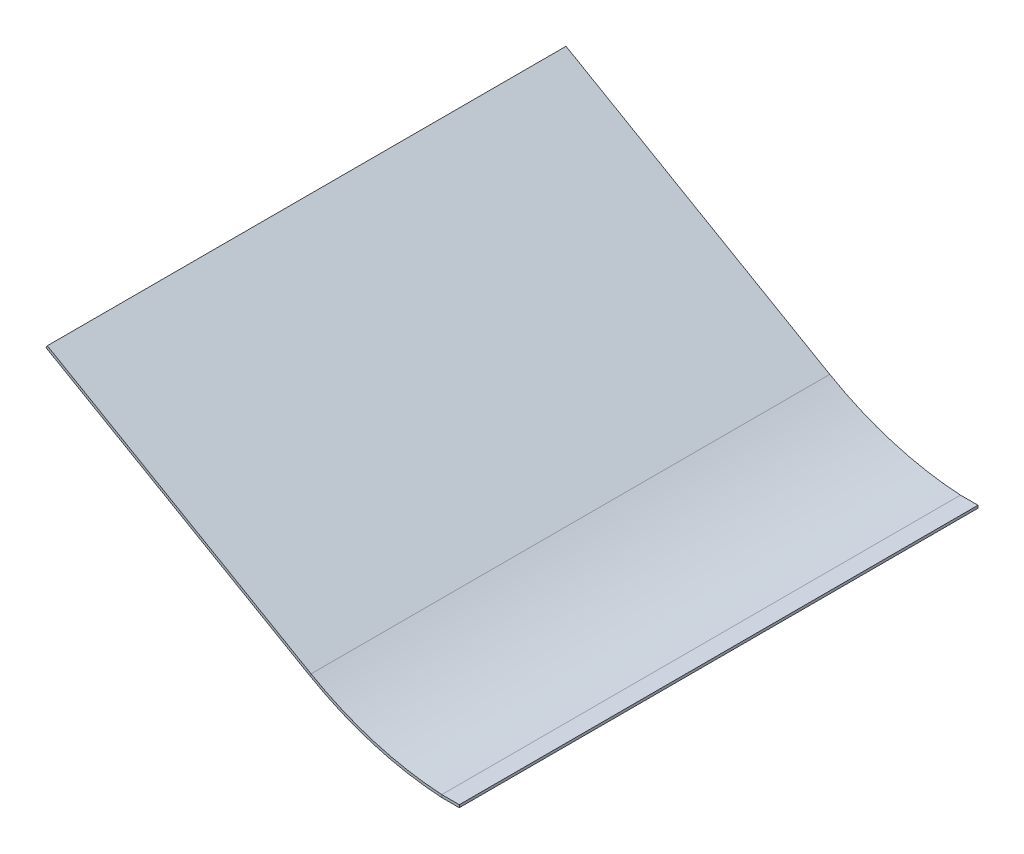
ISO-10303-21;
HEADER;
FILE_DESCRIPTION(('STEP AP214'),'2;1');
FILE_NAME('part.step','',(''),(''),'','','');
FILE_SCHEMA(('AUTOMOTIVE_DESIGN { 1 0 10303 214 1 1 1 1 }'));
ENDSEC;
DATA;
#1=APPLICATION_CONTEXT('core data for automotive mechanical design processes');
#2=APPLICATION_PROTOCOL_DEFINITION('international standard','automotive_design',2000,#1);
#3=PRODUCT_CONTEXT('',#1,'mechanical');
#4=PRODUCT('Part','Part','',(#3));
#5=PRODUCT_RELATED_PRODUCT_CATEGORY('part','',(#4));
#6=PRODUCT_DEFINITION_FORMATION('','',#4);
#7=PRODUCT_DEFINITION_CONTEXT('part definition',#1,'design');
#8=PRODUCT_DEFINITION('design','',#6,#7);
#9=PRODUCT_DEFINITION_SHAPE('','',#8);
#10=(LENGTH_UNIT() NAMED_UNIT(*) SI_UNIT(.MILLI.,.METRE.));
#11=(NAMED_UNIT(*) PLANE_ANGLE_UNIT() SI_UNIT($,.RADIAN.));
#12=(NAMED_UNIT(*) SI_UNIT($,.STERADIAN.) SOLID_ANGLE_UNIT());
#13=UNCERTAINTY_MEASURE_WITH_UNIT(LENGTH_MEASURE(1.E-05),#10,'distance_accuracy_value','');
#14=(GEOMETRIC_REPRESENTATION_CONTEXT(3) GLOBAL_UNCERTAINTY_ASSIGNED_CONTEXT((#13)) GLOBAL_UNIT_ASSIGNED_CONTEXT((#10,
#11,#12)) REPRESENTATION_CONTEXT('',''));
#15=CARTESIAN_POINT('',(0.,0.,0.));
#16=DIRECTION('',(0.,0.,1.));
#17=DIRECTION('',(1.,0.,0.));
#18=AXIS2_PLACEMENT_3D('',#15,#16,#17);
#19=CARTESIAN_POINT('',(-119.69287484573,2.39148694798163,0.));
#20=DIRECTION('',(0.,0.,-1.));
#21=DIRECTION('',(-0.866025403784437,0.500000000000003,0.));
#22=AXIS2_PLACEMENT_3D('',#19,#20,#21);
#23=PLANE('',#22);
#24=DIRECTION('',(0.500000000000003,0.866025403784437,0.));
#25=VECTOR('',#24,1.);
#26=CARTESIAN_POINT('',(-269.692874845731,88.9940273264263,0.));
#27=LINE('',#26,#25);
#28=CARTESIAN_POINT('',(-269.692874845731,88.9940273264263,0.));
#29=VERTEX_POINT('',#28);
#30=CARTESIAN_POINT('',(-268.942874845731,90.293065432103,0.));
#31=VERTEX_POINT('',#30);
#32=EDGE_CURVE('E11',#29,#31,#27,.T.);
#33=ORIENTED_EDGE('',*,*,#32,.F.);
#34=DIRECTION('',(-0.866025403784437,0.500000000000003,0.));
#35=VECTOR('',#34,1.);
#36=CARTESIAN_POINT('',(-119.69287484573,2.39148694798163,0.));
#37=LINE('',#36,#35);
#38=CARTESIAN_POINT('',(-119.69287484573,2.39148694798166,0.));
#39=VERTEX_POINT('',#38);
#40=EDGE_CURVE('E201',#39,#29,#37,.T.);
#41=ORIENTED_EDGE('',*,*,#40,.F.);
#42=DIRECTION('',(0.499999999999995,0.866025403784441,0.));
#43=VECTOR('',#42,1.);
#44=CARTESIAN_POINT('',(-119.69287484573,2.39148694798166,0.));
#45=LINE('',#44,#43);
#46=CARTESIAN_POINT('',(-118.94287484573,3.69052505365829,0.));
#47=VERTEX_POINT('',#46);
#48=EDGE_CURVE('E49',#39,#47,#45,.T.);
#49=ORIENTED_EDGE('',*,*,#48,.T.);
#50=DIRECTION('',(-0.866025403784437,0.500000000000003,0.));
#51=VECTOR('',#50,1.);
#52=CARTESIAN_POINT('',(-118.94287484573,3.69052505365828,0.));
#53=LINE('',#52,#51);
#54=EDGE_CURVE('E156',#47,#31,#53,.T.);
#55=ORIENTED_EDGE('',*,*,#54,.T.);
#56=EDGE_LOOP('',(#33,#41,#49,#55));
#57=FACE_BOUND('',#56,.T.);
#58=ADVANCED_FACE('F39',(#57),#23,.F.);
#59=CARTESIAN_POINT('',(-34.6410161513776,149.705627484771,0.));
#60=DIRECTION('',(0.,0.,1.));
#61=DIRECTION('',(1.,0.,0.));
#62=AXIS2_PLACEMENT_3D('',#59,#60,#61);
#63=PLANE('',#62);
#64=ORIENTED_EDGE('',*,*,#48,.F.);
#65=CARTESIAN_POINT('',(-34.6410161513776,149.705627484771,0.));
#66=DIRECTION('',(0.,0.,-1.));
#67=DIRECTION('',(-0.0589332359340006,-0.998261926401256,0.));
#68=AXIS2_PLACEMENT_3D('',#65,#66,#67);
#69=CIRCLE('',#68,170.103717388707);
#70=CARTESIAN_POINT('',(-44.6657786614968,-20.1024371236945,0.));
#71=VERTEX_POINT('',#70);
#72=EDGE_CURVE('E193',#71,#39,#69,.T.);
#73=ORIENTED_EDGE('',*,*,#72,.F.);
#74=DIRECTION('',(0.0439617176310073,0.999033216356159,0.));
#75=VECTOR('',#74,1.);
#76=CARTESIAN_POINT('',(-44.6657786614968,-20.1024371236945,0.));
#77=LINE('',#76,#75);
#78=CARTESIAN_POINT('',(-44.5998286082665,-18.6037173887073,0.));
#79=VERTEX_POINT('',#78);
#80=EDGE_CURVE('E219',#71,#79,#77,.T.);
#81=ORIENTED_EDGE('',*,*,#80,.T.);
#82=CARTESIAN_POINT('',(-34.6410161513776,149.705627484771,0.));
#83=DIRECTION('',(0.,0.,-1.));
#84=DIRECTION('',(-1.,0.,0.));
#85=AXIS2_PLACEMENT_3D('',#82,#83,#84);
#86=CIRCLE('',#85,168.603717388707);
#87=EDGE_CURVE('E162',#79,#47,#86,.T.);
#88=ORIENTED_EDGE('',*,*,#87,.T.);
#89=EDGE_LOOP('',(#64,#73,#81,#88));
#90=FACE_BOUND('',#89,.T.);
#91=ADVANCED_FACE('F227',(#90),#63,.T.);
#92=CARTESIAN_POINT('',(-44.6223684399079,-19.3671173887073,0.));
#93=DIRECTION('',(0.,0.,1.));
#94=DIRECTION('',(1.,0.,0.));
#95=AXIS2_PLACEMENT_3D('',#92,#93,#94);
#96=PLANE('',#95);
#97=ORIENTED_EDGE('',*,*,#80,.F.);
#98=CARTESIAN_POINT('',(-44.6223684399079,-19.3671173887073,0.));
#99=DIRECTION('',(0.,0.,-1.));
#100=DIRECTION('',(0.,-1.,0.));
#101=AXIS2_PLACEMENT_3D('',#98,#99,#100);
#102=CIRCLE('',#101,0.7366);
#103=CARTESIAN_POINT('',(-44.6223684399079,-20.1037173887073,0.));
#104=VERTEX_POINT('',#103);
#105=EDGE_CURVE('E187',#104,#71,#102,.T.);
#106=ORIENTED_EDGE('',*,*,#105,.F.);
#107=DIRECTION('',(0.0150248582367937,0.999887120446585,0.));
#108=VECTOR('',#107,1.);
#109=CARTESIAN_POINT('',(-44.6223684399079,-20.1037173887073,0.));
#110=LINE('',#109,#108);
#111=EDGE_CURVE('E216',#104,#79,#110,.T.);
#112=ORIENTED_EDGE('',*,*,#111,.T.);
#113=EDGE_LOOP('',(#97,#106,#112));
#114=FACE_BOUND('',#113,.T.);
#115=ADVANCED_FACE('F231',(#114),#96,.T.);
#116=CARTESIAN_POINT('',(-34.6410161513776,-20.1037173887073,0.));
#117=DIRECTION('',(0.,0.,-1.));
#118=DIRECTION('',(-1.,0.,0.));
#119=AXIS2_PLACEMENT_3D('',#116,#117,#118);
#120=PLANE('',#119);
#121=ORIENTED_EDGE('',*,*,#111,.F.);
#122=DIRECTION('',(-1.,0.,0.));
#123=VECTOR('',#122,1.);
#124=CARTESIAN_POINT('',(-34.6410161513776,-20.1037173887073,0.));
#125=LINE('',#124,#123);
#126=CARTESIAN_POINT('',(-34.6410161513776,-20.1037173887073,0.));
#127=VERTEX_POINT('',#126);
#128=EDGE_CURVE('E183',#127,#104,#125,.T.);
#129=ORIENTED_EDGE('',*,*,#128,.F.);
#130=DIRECTION('',(0.,1.,0.));
#131=VECTOR('',#130,1.);
#132=CARTESIAN_POINT('',(-34.6410161513776,-20.1037173887073,0.));
#133=LINE('',#132,#131);
#134=CARTESIAN_POINT('',(-34.6410161513776,-18.6037173887073,0.));
#135=VERTEX_POINT('',#134);
#136=EDGE_CURVE('E101',#127,#135,#133,.T.);
#137=ORIENTED_EDGE('',*,*,#136,.T.);
#138=DIRECTION('',(1.,0.,0.));
#139=VECTOR('',#138,1.);
#140=CARTESIAN_POINT('',(-34.6410161513776,-18.6037173887073,0.));
#141=LINE('',#140,#139);
#142=EDGE_CURVE('E149',#135,#79,#141,.F.);
#143=ORIENTED_EDGE('',*,*,#142,.T.);
#144=EDGE_LOOP('',(#121,#129,#137,#143));
#145=FACE_BOUND('',#144,.T.);
#146=ADVANCED_FACE('F233',(#145),#120,.F.);
#147=CARTESIAN_POINT('',(-34.6410161513776,-20.1037173887073,0.));
#148=DIRECTION('',(1.,0.,0.));
#149=DIRECTION('',(0.,0.,-1.));
#150=AXIS2_PLACEMENT_3D('',#147,#148,#149);
#151=PLANE('',#150);
#152=ORIENTED_EDGE('',*,*,#136,.F.);
#153=DIRECTION('',(0.,0.,-1.));
#154=VECTOR('',#153,1.);
#155=CARTESIAN_POINT('',(-34.6410161513776,-20.1037173887073,0.));
#156=LINE('',#155,#154);
#157=CARTESIAN_POINT('',(-34.6410161513776,-20.1037173887073,-295.));
#158=VERTEX_POINT('',#157);
#159=EDGE_CURVE('E180',#127,#158,#156,.T.);
#160=ORIENTED_EDGE('',*,*,#159,.T.);
#161=DIRECTION('',(0.,1.,0.));
#162=VECTOR('',#161,1.);
#163=CARTESIAN_POINT('',(-34.6410161513776,-20.1037173887073,-295.));
#164=LINE('',#163,#162);
#165=CARTESIAN_POINT('',(-34.6410161513776,-18.6037173887073,-295.));
#166=VERTEX_POINT('',#165);
#167=EDGE_CURVE('E129',#158,#166,#164,.T.);
#168=ORIENTED_EDGE('',*,*,#167,.T.);
#169=DIRECTION('',(0.,0.,1.));
#170=VECTOR('',#169,1.);
#171=CARTESIAN_POINT('',(-34.6410161513776,-18.6037173887073,0.));
#172=LINE('',#171,#170);
#173=EDGE_CURVE('E148',#135,#166,#172,.F.);
#174=ORIENTED_EDGE('',*,*,#173,.F.);
#175=EDGE_LOOP('',(#152,#160,#168,#174));
#176=FACE_BOUND('',#175,.T.);
#177=ADVANCED_FACE('F240',(#176),#151,.T.);
#178=CARTESIAN_POINT('',(-34.6410161513776,-20.1037173887073,-295.));
#179=DIRECTION('',(0.,0.,-1.));
#180=DIRECTION('',(-1.,0.,0.));
#181=AXIS2_PLACEMENT_3D('',#178,#179,#180);
#182=PLANE('',#181);
#183=ORIENTED_EDGE('',*,*,#167,.F.);
#184=DIRECTION('',(-1.,0.,0.));
#185=VECTOR('',#184,1.);
#186=CARTESIAN_POINT('',(-34.6410161513776,-20.1037173887073,-295.));
#187=LINE('',#186,#185);
#188=CARTESIAN_POINT('',(-44.6223684399079,-20.1037173887073,-295.));
#189=VERTEX_POINT('',#188);
#190=EDGE_CURVE('E125',#158,#189,#187,.T.);
#191=ORIENTED_EDGE('',*,*,#190,.T.);
#192=DIRECTION('',(0.0150248582367937,0.999887120446585,0.));
#193=VECTOR('',#192,1.);
#194=CARTESIAN_POINT('',(-44.6223684399079,-20.1037173887073,-295.));
#195=LINE('',#194,#193);
#196=CARTESIAN_POINT('',(-44.5998286082665,-18.6037173887073,-295.));
#197=VERTEX_POINT('',#196);
#198=EDGE_CURVE('E119',#189,#197,#195,.T.);
#199=ORIENTED_EDGE('',*,*,#198,.T.);
#200=DIRECTION('',(1.,0.,0.));
#201=VECTOR('',#200,1.);
#202=CARTESIAN_POINT('',(-34.6410161513776,-18.6037173887073,-295.));
#203=LINE('',#202,#201);
#204=EDGE_CURVE('E123',#166,#197,#203,.F.);
#205=ORIENTED_EDGE('',*,*,#204,.F.);
#206=EDGE_LOOP('',(#183,#191,#199,#205));
#207=FACE_BOUND('',#206,.T.);
#208=ADVANCED_FACE('F121',(#207),#182,.T.);
#209=CARTESIAN_POINT('',(-44.6223684399079,-19.3671173887073,-295.));
#210=DIRECTION('',(0.,0.,1.));
#211=DIRECTION('',(1.,0.,0.));
#212=AXIS2_PLACEMENT_3D('',#209,#210,#211);
#213=PLANE('',#212);
#214=ORIENTED_EDGE('',*,*,#198,.F.);
#215=CARTESIAN_POINT('',(-44.6223684399079,-19.3671173887073,-295.));
#216=DIRECTION('',(0.,0.,-1.));
#217=DIRECTION('',(0.,-1.,0.));
#218=AXIS2_PLACEMENT_3D('',#215,#216,#217);
#219=CIRCLE('',#218,0.7366);
#220=CARTESIAN_POINT('',(-44.6657786614968,-20.1024371236945,-295.));
#221=VERTEX_POINT('',#220);
#222=EDGE_CURVE('E134',#189,#221,#219,.T.);
#223=ORIENTED_EDGE('',*,*,#222,.T.);
#224=DIRECTION('',(0.0439617176310073,0.999033216356159,0.));
#225=VECTOR('',#224,1.);
#226=CARTESIAN_POINT('',(-44.6657786614968,-20.1024371236945,-295.));
#227=LINE('',#226,#225);
#228=EDGE_CURVE('E130',#221,#197,#227,.T.);
#229=ORIENTED_EDGE('',*,*,#228,.T.);
#230=EDGE_LOOP('',(#214,#223,#229));
#231=FACE_BOUND('',#230,.T.);
#232=ADVANCED_FACE('F132',(#231),#213,.F.);
#233=CARTESIAN_POINT('',(-34.6410161513776,149.705627484771,-295.));
#234=DIRECTION('',(0.,0.,1.));
#235=DIRECTION('',(1.,0.,0.));
#236=AXIS2_PLACEMENT_3D('',#233,#234,#235);
#237=PLANE('',#236);
#238=ORIENTED_EDGE('',*,*,#228,.F.);
#239=CARTESIAN_POINT('',(-34.6410161513776,149.705627484771,-295.));
#240=DIRECTION('',(0.,0.,-1.));
#241=DIRECTION('',(-0.0589332359340006,-0.998261926401256,0.));
#242=AXIS2_PLACEMENT_3D('',#239,#240,#241);
#243=CIRCLE('',#242,170.103717388707);
#244=CARTESIAN_POINT('',(-119.69287484573,2.39148694798166,-295.));
#245=VERTEX_POINT('',#244);
#246=EDGE_CURVE('E199',#221,#245,#243,.T.);
#247=ORIENTED_EDGE('',*,*,#246,.T.);
#248=DIRECTION('',(0.500000000000003,0.866025403784437,0.));
#249=VECTOR('',#248,1.);
#250=CARTESIAN_POINT('',(-119.69287484573,2.39148694798166,-295.));
#251=LINE('',#250,#249);
#252=CARTESIAN_POINT('',(-118.94287484573,3.69052505365827,-295.));
#253=VERTEX_POINT('',#252);
#254=EDGE_CURVE('E139',#245,#253,#251,.T.);
#255=ORIENTED_EDGE('',*,*,#254,.T.);
#256=CARTESIAN_POINT('',(-34.6410161513776,149.705627484771,-295.));
#257=DIRECTION('',(0.,0.,-1.));
#258=DIRECTION('',(-1.,0.,0.));
#259=AXIS2_PLACEMENT_3D('',#256,#257,#258);
#260=CIRCLE('',#259,168.603717388707);
#261=EDGE_CURVE('E152',#197,#253,#260,.T.);
#262=ORIENTED_EDGE('',*,*,#261,.F.);
#263=EDGE_LOOP('',(#238,#247,#255,#262));
#264=FACE_BOUND('',#263,.T.);
#265=ADVANCED_FACE('F153',(#264),#237,.F.);
#266=CARTESIAN_POINT('',(-119.69287484573,2.39148694798163,-295.));
#267=DIRECTION('',(0.,0.,-1.));
#268=DIRECTION('',(-0.866025403784437,0.500000000000003,0.));
#269=AXIS2_PLACEMENT_3D('',#266,#267,#268);
#270=PLANE('',#269);
#271=ORIENTED_EDGE('',*,*,#254,.F.);
#272=DIRECTION('',(-0.866025403784437,0.500000000000003,0.));
#273=VECTOR('',#272,1.);
#274=CARTESIAN_POINT('',(-119.69287484573,2.39148694798163,-295.));
#275=LINE('',#274,#273);
#276=CARTESIAN_POINT('',(-269.692874845731,88.9940273264263,-295.));
#277=VERTEX_POINT('',#276);
#278=EDGE_CURVE('E206',#245,#277,#275,.T.);
#279=ORIENTED_EDGE('',*,*,#278,.T.);
#280=DIRECTION('',(0.500000000000003,0.866025403784437,0.));
#281=VECTOR('',#280,1.);
#282=CARTESIAN_POINT('',(-269.692874845731,88.9940273264263,-295.));
#283=LINE('',#282,#281);
#284=CARTESIAN_POINT('',(-268.942874845731,90.293065432103,-295.));
#285=VERTEX_POINT('',#284);
#286=EDGE_CURVE('E43',#277,#285,#283,.T.);
#287=ORIENTED_EDGE('',*,*,#286,.T.);
#288=DIRECTION('',(-0.866025403784437,0.500000000000003,0.));
#289=VECTOR('',#288,1.);
#290=CARTESIAN_POINT('',(-118.94287484573,3.69052505365828,-295.));
#291=LINE('',#290,#289);
#292=EDGE_CURVE('E243',#253,#285,#291,.T.);
#293=ORIENTED_EDGE('',*,*,#292,.F.);
#294=EDGE_LOOP('',(#271,#279,#287,#293));
#295=FACE_BOUND('',#294,.T.);
#296=ADVANCED_FACE('F250',(#295),#270,.T.);
#297=CARTESIAN_POINT('',(-269.692874845731,88.9940273264263,0.));
#298=DIRECTION('',(0.866025403784437,-0.500000000000003,0.));
#299=DIRECTION('',(0.,0.,-1.));
#300=AXIS2_PLACEMENT_3D('',#297,#298,#299);
#301=PLANE('',#300);
#302=DIRECTION('',(0.,0.,-1.));
#303=VECTOR('',#302,1.);
#304=CARTESIAN_POINT('',(-269.692874845731,88.9940273264263,0.));
#305=LINE('',#304,#303);
#306=EDGE_CURVE('E204',#29,#277,#305,.T.);
#307=ORIENTED_EDGE('',*,*,#306,.F.);
#308=ORIENTED_EDGE('',*,*,#32,.T.);
#309=DIRECTION('',(0.,0.,1.));
#310=VECTOR('',#309,1.);
#311=CARTESIAN_POINT('',(-268.942874845731,90.293065432103,0.));
#312=LINE('',#311,#310);
#313=EDGE_CURVE('E167',#31,#285,#312,.F.);
#314=ORIENTED_EDGE('',*,*,#313,.T.);
#315=ORIENTED_EDGE('',*,*,#286,.F.);
#316=EDGE_LOOP('',(#307,#308,#314,#315));
#317=FACE_BOUND('',#316,.T.);
#318=ADVANCED_FACE('F41',(#317),#301,.F.);
#319=CARTESIAN_POINT('',(-118.94287484573,3.69052505365828,0.));
#320=DIRECTION('',(0.500000000000003,0.866025403784437,0.));
#321=DIRECTION('',(-0.866025403784437,0.500000000000003,0.));
#322=AXIS2_PLACEMENT_3D('',#319,#320,#321);
#323=PLANE('',#322);
#324=ORIENTED_EDGE('',*,*,#292,.T.);
#325=ORIENTED_EDGE('',*,*,#313,.F.);
#326=ORIENTED_EDGE('',*,*,#54,.F.);
#327=DIRECTION('',(0.,0.,1.));
#328=VECTOR('',#327,1.);
#329=CARTESIAN_POINT('',(-118.94287484573,3.69052505365829,0.));
#330=LINE('',#329,#328);
#331=EDGE_CURVE('E157',#47,#253,#330,.F.);
#332=ORIENTED_EDGE('',*,*,#331,.T.);
#333=EDGE_LOOP('',(#324,#325,#326,#332));
#334=FACE_BOUND('',#333,.T.);
#335=ADVANCED_FACE('F249',(#334),#323,.T.);
#336=CARTESIAN_POINT('',(-34.6410161513776,149.705627484771,0.));
#337=DIRECTION('',(0.,0.,-1.));
#338=DIRECTION('',(-1.,0.,0.));
#339=AXIS2_PLACEMENT_3D('',#336,#337,#338);
#340=CYLINDRICAL_SURFACE('',#339,168.603717388707);
#341=ORIENTED_EDGE('',*,*,#261,.T.);
#342=ORIENTED_EDGE('',*,*,#331,.F.);
#343=ORIENTED_EDGE('',*,*,#87,.F.);
#344=DIRECTION('',(0.,0.,-1.));
#345=VECTOR('',#344,1.);
#346=CARTESIAN_POINT('',(-44.5998286082665,-18.6037173887073,0.));
#347=LINE('',#346,#345);
#348=EDGE_CURVE('E146',#79,#197,#347,.T.);
#349=ORIENTED_EDGE('',*,*,#348,.T.);
#350=EDGE_LOOP('',(#341,#342,#343,#349));
#351=FACE_BOUND('',#350,.T.);
#352=ADVANCED_FACE('F160',(#351),#340,.F.);
#353=CARTESIAN_POINT('',(-34.6410161513776,-18.6037173887073,0.));
#354=DIRECTION('',(0.,1.,0.));
#355=DIRECTION('',(0.,0.,1.));
#356=AXIS2_PLACEMENT_3D('',#353,#354,#355);
#357=PLANE('',#356);
#358=ORIENTED_EDGE('',*,*,#204,.T.);
#359=ORIENTED_EDGE('',*,*,#348,.F.);
#360=ORIENTED_EDGE('',*,*,#142,.F.);
#361=ORIENTED_EDGE('',*,*,#173,.T.);
#362=EDGE_LOOP('',(#358,#359,#360,#361));
#363=FACE_BOUND('',#362,.T.);
#364=ADVANCED_FACE('F144',(#363),#357,.T.);
#365=CARTESIAN_POINT('',(-119.69287484573,2.39148694798163,0.));
#366=DIRECTION('',(0.500000000000003,0.866025403784437,0.));
#367=DIRECTION('',(-0.866025403784437,0.500000000000003,0.));
#368=AXIS2_PLACEMENT_3D('',#365,#366,#367);
#369=PLANE('',#368);
#370=ORIENTED_EDGE('',*,*,#278,.F.);
#371=DIRECTION('',(0.,0.,-1.));
#372=VECTOR('',#371,1.);
#373=CARTESIAN_POINT('',(-119.69287484573,2.39148694798164,0.));
#374=LINE('',#373,#372);
#375=EDGE_CURVE('E196',#39,#245,#374,.T.);
#376=ORIENTED_EDGE('',*,*,#375,.F.);
#377=ORIENTED_EDGE('',*,*,#40,.T.);
#378=ORIENTED_EDGE('',*,*,#306,.T.);
#379=EDGE_LOOP('',(#370,#376,#377,#378));
#380=FACE_BOUND('',#379,.T.);
#381=ADVANCED_FACE('F257',(#380),#369,.F.);
#382=CARTESIAN_POINT('',(-34.6410161513776,149.705627484771,0.));
#383=DIRECTION('',(0.,0.,-1.));
#384=DIRECTION('',(-1.,0.,0.));
#385=AXIS2_PLACEMENT_3D('',#382,#383,#384);
#386=CYLINDRICAL_SURFACE('',#385,170.103717388707);
#387=ORIENTED_EDGE('',*,*,#246,.F.);
#388=DIRECTION('',(0.,0.,-1.));
#389=VECTOR('',#388,1.);
#390=CARTESIAN_POINT('',(-44.6657786614968,-20.1024371236945,0.));
#391=LINE('',#390,#389);
#392=EDGE_CURVE('E190',#71,#221,#391,.T.);
#393=ORIENTED_EDGE('',*,*,#392,.F.);
#394=ORIENTED_EDGE('',*,*,#72,.T.);
#395=ORIENTED_EDGE('',*,*,#375,.T.);
#396=EDGE_LOOP('',(#387,#393,#394,#395));
#397=FACE_BOUND('',#396,.T.);
#398=ADVANCED_FACE('F255',(#397),#386,.T.);
#399=CARTESIAN_POINT('',(-44.6223684399079,-19.3671173887073,0.));
#400=DIRECTION('',(0.,0.,-1.));
#401=DIRECTION('',(-1.,0.,0.));
#402=AXIS2_PLACEMENT_3D('',#399,#400,#401);
#403=CYLINDRICAL_SURFACE('',#402,0.7366);
#404=ORIENTED_EDGE('',*,*,#222,.F.);
#405=DIRECTION('',(0.,0.,-1.));
#406=VECTOR('',#405,1.);
#407=CARTESIAN_POINT('',(-44.6223684399079,-20.1037173887073,0.));
#408=LINE('',#407,#406);
#409=EDGE_CURVE('E184',#104,#189,#408,.T.);
#410=ORIENTED_EDGE('',*,*,#409,.F.);
#411=ORIENTED_EDGE('',*,*,#105,.T.);
#412=ORIENTED_EDGE('',*,*,#392,.T.);
#413=EDGE_LOOP('',(#404,#410,#411,#412));
#414=FACE_BOUND('',#413,.T.);
#415=ADVANCED_FACE('F235',(#414),#403,.T.);
#416=CARTESIAN_POINT('',(-34.6410161513776,-20.1037173887073,0.));
#417=DIRECTION('',(0.,1.,0.));
#418=DIRECTION('',(0.,0.,1.));
#419=AXIS2_PLACEMENT_3D('',#416,#417,#418);
#420=PLANE('',#419);
#421=ORIENTED_EDGE('',*,*,#190,.F.);
#422=ORIENTED_EDGE('',*,*,#159,.F.);
#423=ORIENTED_EDGE('',*,*,#128,.T.);
#424=ORIENTED_EDGE('',*,*,#409,.T.);
#425=EDGE_LOOP('',(#421,#422,#423,#424));
#426=FACE_BOUND('',#425,.T.);
#427=ADVANCED_FACE('F238',(#426),#420,.F.);
#428=CLOSED_SHELL('',(#58,#91,#115,#146,#177,#208,#232,#265,#296,#318,#335,#352,#364,#381,#398,
#415,#427));
#429=MANIFOLD_SOLID_BREP('B2',#428);
#430=ADVANCED_BREP_SHAPE_REPRESENTATION('',(#18,#429),#14);
#431=SHAPE_DEFINITION_REPRESENTATION(#9,#430);
ENDSEC;
END-ISO-10303-21;
